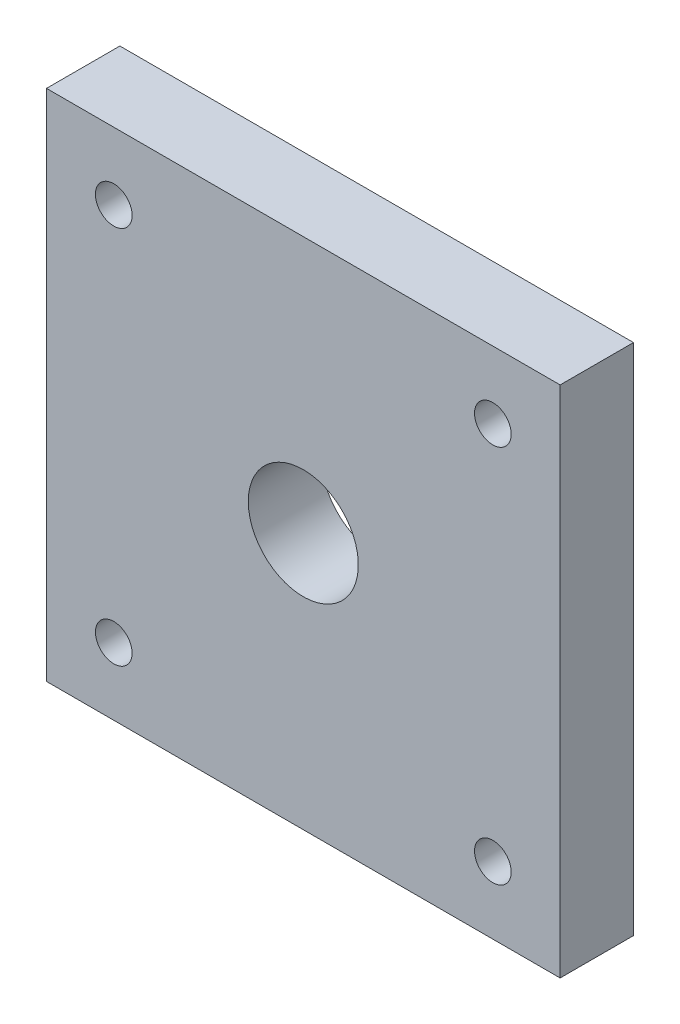
ISO-10303-21;
HEADER;
FILE_DESCRIPTION(('STEP AP214'),'2;1');
FILE_NAME('part.step','',(''),(''),'','','');
FILE_SCHEMA(('AUTOMOTIVE_DESIGN { 1 0 10303 214 1 1 1 1 }'));
ENDSEC;
DATA;
#1=APPLICATION_CONTEXT('core data for automotive mechanical design processes');
#2=APPLICATION_PROTOCOL_DEFINITION('international standard','automotive_design',2000,#1);
#3=PRODUCT_CONTEXT('',#1,'mechanical');
#4=PRODUCT('Part','Part','',(#3));
#5=PRODUCT_RELATED_PRODUCT_CATEGORY('part','',(#4));
#6=PRODUCT_DEFINITION_FORMATION('','',#4);
#7=PRODUCT_DEFINITION_CONTEXT('part definition',#1,'design');
#8=PRODUCT_DEFINITION('design','',#6,#7);
#9=PRODUCT_DEFINITION_SHAPE('','',#8);
#10=(LENGTH_UNIT() NAMED_UNIT(*) SI_UNIT(.MILLI.,.METRE.));
#11=(NAMED_UNIT(*) PLANE_ANGLE_UNIT() SI_UNIT($,.RADIAN.));
#12=(NAMED_UNIT(*) SI_UNIT($,.STERADIAN.) SOLID_ANGLE_UNIT());
#13=UNCERTAINTY_MEASURE_WITH_UNIT(LENGTH_MEASURE(1.E-05),#10,'distance_accuracy_value','');
#14=(GEOMETRIC_REPRESENTATION_CONTEXT(3) GLOBAL_UNCERTAINTY_ASSIGNED_CONTEXT((#13)) GLOBAL_UNIT_ASSIGNED_CONTEXT((#10,
#11,#12)) REPRESENTATION_CONTEXT('',''));
#15=CARTESIAN_POINT('',(0.,0.,0.));
#16=DIRECTION('',(0.,0.,1.));
#17=DIRECTION('',(1.,0.,0.));
#18=AXIS2_PLACEMENT_3D('',#15,#16,#17);
#19=CARTESIAN_POINT('',(21.,21.,6.));
#20=DIRECTION('',(-1.,0.,0.));
#21=DIRECTION('',(0.,-1.,0.));
#22=AXIS2_PLACEMENT_3D('',#19,#20,#21);
#23=PLANE('',#22);
#24=DIRECTION('',(0.,1.,0.));
#25=VECTOR('',#24,1.);
#26=CARTESIAN_POINT('',(21.,21.,0.));
#27=LINE('',#26,#25);
#28=CARTESIAN_POINT('',(21.,-21.,0.));
#29=VERTEX_POINT('',#28);
#30=CARTESIAN_POINT('',(21.,21.,0.));
#31=VERTEX_POINT('',#30);
#32=EDGE_CURVE('E107',#29,#31,#27,.T.);
#33=ORIENTED_EDGE('',*,*,#32,.T.);
#34=DIRECTION('',(0.,0.,-1.));
#35=VECTOR('',#34,1.);
#36=CARTESIAN_POINT('',(21.,21.,6.));
#37=LINE('',#36,#35);
#38=CARTESIAN_POINT('',(21.,21.,6.));
#39=VERTEX_POINT('',#38);
#40=EDGE_CURVE('E11',#39,#31,#37,.T.);
#41=ORIENTED_EDGE('',*,*,#40,.F.);
#42=DIRECTION('',(0.,1.,0.));
#43=VECTOR('',#42,1.);
#44=CARTESIAN_POINT('',(21.,21.,6.));
#45=LINE('',#44,#43);
#46=CARTESIAN_POINT('',(21.,-21.,6.));
#47=VERTEX_POINT('',#46);
#48=EDGE_CURVE('E91',#47,#39,#45,.T.);
#49=ORIENTED_EDGE('',*,*,#48,.F.);
#50=DIRECTION('',(0.,0.,-1.));
#51=VECTOR('',#50,1.);
#52=CARTESIAN_POINT('',(21.,-21.,6.));
#53=LINE('',#52,#51);
#54=EDGE_CURVE('E103',#47,#29,#53,.T.);
#55=ORIENTED_EDGE('',*,*,#54,.T.);
#56=EDGE_LOOP('',(#33,#41,#49,#55));
#57=FACE_BOUND('',#56,.T.);
#58=ADVANCED_FACE('F39',(#57),#23,.F.);
#59=CARTESIAN_POINT('',(-21.,21.,6.));
#60=DIRECTION('',(0.,-1.,0.));
#61=DIRECTION('',(0.,0.,-1.));
#62=AXIS2_PLACEMENT_3D('',#59,#60,#61);
#63=PLANE('',#62);
#64=DIRECTION('',(-1.,0.,0.));
#65=VECTOR('',#64,1.);
#66=CARTESIAN_POINT('',(-21.,21.,0.));
#67=LINE('',#66,#65);
#68=CARTESIAN_POINT('',(-21.,21.,0.));
#69=VERTEX_POINT('',#68);
#70=EDGE_CURVE('E96',#31,#69,#67,.T.);
#71=ORIENTED_EDGE('',*,*,#70,.T.);
#72=DIRECTION('',(0.,0.,-1.));
#73=VECTOR('',#72,1.);
#74=CARTESIAN_POINT('',(-21.,21.,6.));
#75=LINE('',#74,#73);
#76=CARTESIAN_POINT('',(-21.,21.,6.));
#77=VERTEX_POINT('',#76);
#78=EDGE_CURVE('E48',#77,#69,#75,.T.);
#79=ORIENTED_EDGE('',*,*,#78,.F.);
#80=DIRECTION('',(-1.,0.,0.));
#81=VECTOR('',#80,1.);
#82=CARTESIAN_POINT('',(-21.,21.,6.));
#83=LINE('',#82,#81);
#84=EDGE_CURVE('E86',#39,#77,#83,.T.);
#85=ORIENTED_EDGE('',*,*,#84,.F.);
#86=ORIENTED_EDGE('',*,*,#40,.T.);
#87=EDGE_LOOP('',(#71,#79,#85,#86));
#88=FACE_BOUND('',#87,.T.);
#89=ADVANCED_FACE('F95',(#88),#63,.F.);
#90=CARTESIAN_POINT('',(-21.,21.,6.));
#91=DIRECTION('',(1.,0.,0.));
#92=DIRECTION('',(0.,1.,0.));
#93=AXIS2_PLACEMENT_3D('',#90,#91,#92);
#94=PLANE('',#93);
#95=DIRECTION('',(0.,-1.,0.));
#96=VECTOR('',#95,1.);
#97=CARTESIAN_POINT('',(-21.,21.,0.));
#98=LINE('',#97,#96);
#99=CARTESIAN_POINT('',(-21.,-21.,0.));
#100=VERTEX_POINT('',#99);
#101=EDGE_CURVE('E73',#69,#100,#98,.T.);
#102=ORIENTED_EDGE('',*,*,#101,.T.);
#103=DIRECTION('',(0.,0.,-1.));
#104=VECTOR('',#103,1.);
#105=CARTESIAN_POINT('',(-21.,-21.,6.));
#106=LINE('',#105,#104);
#107=CARTESIAN_POINT('',(-21.,-21.,6.));
#108=VERTEX_POINT('',#107);
#109=EDGE_CURVE('E98',#108,#100,#106,.T.);
#110=ORIENTED_EDGE('',*,*,#109,.F.);
#111=DIRECTION('',(0.,-1.,0.));
#112=VECTOR('',#111,1.);
#113=CARTESIAN_POINT('',(-21.,21.,6.));
#114=LINE('',#113,#112);
#115=EDGE_CURVE('E89',#77,#108,#114,.T.);
#116=ORIENTED_EDGE('',*,*,#115,.F.);
#117=ORIENTED_EDGE('',*,*,#78,.T.);
#118=EDGE_LOOP('',(#102,#110,#116,#117));
#119=FACE_BOUND('',#118,.T.);
#120=ADVANCED_FACE('F99',(#119),#94,.F.);
#121=CARTESIAN_POINT('',(-21.,-21.,6.));
#122=DIRECTION('',(0.,1.,0.));
#123=DIRECTION('',(0.,0.,1.));
#124=AXIS2_PLACEMENT_3D('',#121,#122,#123);
#125=PLANE('',#124);
#126=DIRECTION('',(1.,0.,0.));
#127=VECTOR('',#126,1.);
#128=CARTESIAN_POINT('',(-21.,-21.,0.));
#129=LINE('',#128,#127);
#130=EDGE_CURVE('E79',#100,#29,#129,.T.);
#131=ORIENTED_EDGE('',*,*,#130,.T.);
#132=ORIENTED_EDGE('',*,*,#54,.F.);
#133=DIRECTION('',(1.,0.,0.));
#134=VECTOR('',#133,1.);
#135=CARTESIAN_POINT('',(-21.,-21.,6.));
#136=LINE('',#135,#134);
#137=EDGE_CURVE('E56',#108,#47,#136,.T.);
#138=ORIENTED_EDGE('',*,*,#137,.F.);
#139=ORIENTED_EDGE('',*,*,#109,.T.);
#140=EDGE_LOOP('',(#131,#132,#138,#139));
#141=FACE_BOUND('',#140,.T.);
#142=ADVANCED_FACE('F121',(#141),#125,.F.);
#143=CARTESIAN_POINT('',(0.,0.,6.));
#144=DIRECTION('',(0.,0.,1.));
#145=DIRECTION('',(1.,0.,0.));
#146=AXIS2_PLACEMENT_3D('',#143,#144,#145);
#147=PLANE('',#146);
#148=CARTESIAN_POINT('',(0.,0.,6.));
#149=DIRECTION('',(0.,0.,-1.));
#150=DIRECTION('',(-1.,0.,0.));
#151=AXIS2_PLACEMENT_3D('',#148,#149,#150);
#152=CIRCLE('',#151,4.5);
#153=CARTESIAN_POINT('',(-4.5,0.,6.));
#154=VERTEX_POINT('',#153);
#155=EDGE_CURVE('E141',#154,#154,#152,.T.);
#156=ORIENTED_EDGE('',*,*,#155,.T.);
#157=EDGE_LOOP('',(#156));
#158=FACE_BOUND('',#157,.T.);
#159=CARTESIAN_POINT('',(15.5,-15.5,6.));
#160=DIRECTION('',(0.,0.,-1.));
#161=DIRECTION('',(-1.,0.,0.));
#162=AXIS2_PLACEMENT_3D('',#159,#160,#161);
#163=CIRCLE('',#162,1.5);
#164=CARTESIAN_POINT('',(14.,-15.5,6.));
#165=VERTEX_POINT('',#164);
#166=EDGE_CURVE('E136',#165,#165,#163,.T.);
#167=ORIENTED_EDGE('',*,*,#166,.T.);
#168=EDGE_LOOP('',(#167));
#169=FACE_BOUND('',#168,.T.);
#170=CARTESIAN_POINT('',(-15.5,-15.5,6.));
#171=DIRECTION('',(0.,0.,-1.));
#172=DIRECTION('',(-1.,0.,0.));
#173=AXIS2_PLACEMENT_3D('',#170,#171,#172);
#174=CIRCLE('',#173,1.5);
#175=CARTESIAN_POINT('',(-17.,-15.5,6.));
#176=VERTEX_POINT('',#175);
#177=EDGE_CURVE('E145',#176,#176,#174,.T.);
#178=ORIENTED_EDGE('',*,*,#177,.T.);
#179=EDGE_LOOP('',(#178));
#180=FACE_BOUND('',#179,.T.);
#181=CARTESIAN_POINT('',(-15.5,15.5,6.));
#182=DIRECTION('',(0.,0.,-1.));
#183=DIRECTION('',(-1.,0.,0.));
#184=AXIS2_PLACEMENT_3D('',#181,#182,#183);
#185=CIRCLE('',#184,1.5);
#186=CARTESIAN_POINT('',(-17.,15.5,6.));
#187=VERTEX_POINT('',#186);
#188=EDGE_CURVE('E153',#187,#187,#185,.T.);
#189=ORIENTED_EDGE('',*,*,#188,.T.);
#190=EDGE_LOOP('',(#189));
#191=FACE_BOUND('',#190,.T.);
#192=CARTESIAN_POINT('',(15.5,15.5,6.));
#193=DIRECTION('',(0.,0.,-1.));
#194=DIRECTION('',(-1.,0.,0.));
#195=AXIS2_PLACEMENT_3D('',#192,#193,#194);
#196=CIRCLE('',#195,1.5);
#197=CARTESIAN_POINT('',(14.,15.5,6.));
#198=VERTEX_POINT('',#197);
#199=EDGE_CURVE('E111',#198,#198,#196,.T.);
#200=ORIENTED_EDGE('',*,*,#199,.T.);
#201=EDGE_LOOP('',(#200));
#202=FACE_BOUND('',#201,.T.);
#203=ORIENTED_EDGE('',*,*,#48,.T.);
#204=ORIENTED_EDGE('',*,*,#84,.T.);
#205=ORIENTED_EDGE('',*,*,#115,.T.);
#206=ORIENTED_EDGE('',*,*,#137,.T.);
#207=EDGE_LOOP('',(#203,#204,#205,#206));
#208=FACE_BOUND('',#207,.T.);
#209=ADVANCED_FACE('F87',(#158,#169,#180,#191,#202,#208),#147,.T.);
#210=CARTESIAN_POINT('',(0.,0.,0.));
#211=DIRECTION('',(0.,0.,1.));
#212=DIRECTION('',(1.,0.,0.));
#213=AXIS2_PLACEMENT_3D('',#210,#211,#212);
#214=PLANE('',#213);
#215=CARTESIAN_POINT('',(0.,0.,0.));
#216=DIRECTION('',(0.,0.,-1.));
#217=DIRECTION('',(-1.,0.,0.));
#218=AXIS2_PLACEMENT_3D('',#215,#216,#217);
#219=CIRCLE('',#218,4.5);
#220=CARTESIAN_POINT('',(-4.5,0.,0.));
#221=VERTEX_POINT('',#220);
#222=EDGE_CURVE('E160',#221,#221,#219,.T.);
#223=ORIENTED_EDGE('',*,*,#222,.F.);
#224=EDGE_LOOP('',(#223));
#225=FACE_BOUND('',#224,.T.);
#226=CARTESIAN_POINT('',(15.5,-15.5,0.));
#227=DIRECTION('',(0.,0.,-1.));
#228=DIRECTION('',(-1.,0.,0.));
#229=AXIS2_PLACEMENT_3D('',#226,#227,#228);
#230=CIRCLE('',#229,1.5);
#231=CARTESIAN_POINT('',(14.,-15.5,0.));
#232=VERTEX_POINT('',#231);
#233=EDGE_CURVE('E140',#232,#232,#230,.T.);
#234=ORIENTED_EDGE('',*,*,#233,.F.);
#235=EDGE_LOOP('',(#234));
#236=FACE_BOUND('',#235,.T.);
#237=CARTESIAN_POINT('',(-15.5,-15.5,0.));
#238=DIRECTION('',(0.,0.,-1.));
#239=DIRECTION('',(-1.,0.,0.));
#240=AXIS2_PLACEMENT_3D('',#237,#238,#239);
#241=CIRCLE('',#240,1.5);
#242=CARTESIAN_POINT('',(-17.,-15.5,0.));
#243=VERTEX_POINT('',#242);
#244=EDGE_CURVE('E149',#243,#243,#241,.T.);
#245=ORIENTED_EDGE('',*,*,#244,.F.);
#246=EDGE_LOOP('',(#245));
#247=FACE_BOUND('',#246,.T.);
#248=CARTESIAN_POINT('',(-15.5,15.5,0.));
#249=DIRECTION('',(0.,0.,-1.));
#250=DIRECTION('',(-1.,0.,0.));
#251=AXIS2_PLACEMENT_3D('',#248,#249,#250);
#252=CIRCLE('',#251,1.5);
#253=CARTESIAN_POINT('',(-17.,15.5,0.));
#254=VERTEX_POINT('',#253);
#255=EDGE_CURVE('E132',#254,#254,#252,.T.);
#256=ORIENTED_EDGE('',*,*,#255,.F.);
#257=EDGE_LOOP('',(#256));
#258=FACE_BOUND('',#257,.T.);
#259=CARTESIAN_POINT('',(15.5,15.5,0.));
#260=DIRECTION('',(0.,0.,-1.));
#261=DIRECTION('',(-1.,0.,0.));
#262=AXIS2_PLACEMENT_3D('',#259,#260,#261);
#263=CIRCLE('',#262,1.5);
#264=CARTESIAN_POINT('',(14.,15.5,0.));
#265=VERTEX_POINT('',#264);
#266=EDGE_CURVE('E128',#265,#265,#263,.T.);
#267=ORIENTED_EDGE('',*,*,#266,.F.);
#268=EDGE_LOOP('',(#267));
#269=FACE_BOUND('',#268,.T.);
#270=ORIENTED_EDGE('',*,*,#32,.F.);
#271=ORIENTED_EDGE('',*,*,#130,.F.);
#272=ORIENTED_EDGE('',*,*,#101,.F.);
#273=ORIENTED_EDGE('',*,*,#70,.F.);
#274=EDGE_LOOP('',(#270,#271,#272,#273));
#275=FACE_BOUND('',#274,.T.);
#276=ADVANCED_FACE('F124',(#225,#236,#247,#258,#269,#275),#214,.F.);
#277=CARTESIAN_POINT('',(15.5,15.5,6.));
#278=DIRECTION('',(0.,0.,-1.));
#279=DIRECTION('',(-1.,0.,0.));
#280=AXIS2_PLACEMENT_3D('',#277,#278,#279);
#281=CYLINDRICAL_SURFACE('',#280,1.5);
#282=ORIENTED_EDGE('',*,*,#199,.F.);
#283=EDGE_LOOP('',(#282));
#284=FACE_BOUND('',#283,.T.);
#285=ORIENTED_EDGE('',*,*,#266,.T.);
#286=EDGE_LOOP('',(#285));
#287=FACE_BOUND('',#286,.T.);
#288=ADVANCED_FACE('F179',(#284,#287),#281,.F.);
#289=CARTESIAN_POINT('',(-15.5,15.5,6.));
#290=DIRECTION('',(0.,0.,-1.));
#291=DIRECTION('',(-1.,0.,0.));
#292=AXIS2_PLACEMENT_3D('',#289,#290,#291);
#293=CYLINDRICAL_SURFACE('',#292,1.5);
#294=ORIENTED_EDGE('',*,*,#188,.F.);
#295=EDGE_LOOP('',(#294));
#296=FACE_BOUND('',#295,.T.);
#297=ORIENTED_EDGE('',*,*,#255,.T.);
#298=EDGE_LOOP('',(#297));
#299=FACE_BOUND('',#298,.T.);
#300=ADVANCED_FACE('F190',(#296,#299),#293,.F.);
#301=CARTESIAN_POINT('',(-15.5,-15.5,6.));
#302=DIRECTION('',(0.,0.,-1.));
#303=DIRECTION('',(-1.,0.,0.));
#304=AXIS2_PLACEMENT_3D('',#301,#302,#303);
#305=CYLINDRICAL_SURFACE('',#304,1.5);
#306=ORIENTED_EDGE('',*,*,#177,.F.);
#307=EDGE_LOOP('',(#306));
#308=FACE_BOUND('',#307,.T.);
#309=ORIENTED_EDGE('',*,*,#244,.T.);
#310=EDGE_LOOP('',(#309));
#311=FACE_BOUND('',#310,.T.);
#312=ADVANCED_FACE('F196',(#308,#311),#305,.F.);
#313=CARTESIAN_POINT('',(15.5,-15.5,6.));
#314=DIRECTION('',(0.,0.,-1.));
#315=DIRECTION('',(-1.,0.,0.));
#316=AXIS2_PLACEMENT_3D('',#313,#314,#315);
#317=CYLINDRICAL_SURFACE('',#316,1.5);
#318=ORIENTED_EDGE('',*,*,#166,.F.);
#319=EDGE_LOOP('',(#318));
#320=FACE_BOUND('',#319,.T.);
#321=ORIENTED_EDGE('',*,*,#233,.T.);
#322=EDGE_LOOP('',(#321));
#323=FACE_BOUND('',#322,.T.);
#324=ADVANCED_FACE('F173',(#320,#323),#317,.F.);
#325=CARTESIAN_POINT('',(0.,0.,6.));
#326=DIRECTION('',(0.,0.,-1.));
#327=DIRECTION('',(-1.,0.,0.));
#328=AXIS2_PLACEMENT_3D('',#325,#326,#327);
#329=CYLINDRICAL_SURFACE('',#328,4.5);
#330=ORIENTED_EDGE('',*,*,#155,.F.);
#331=EDGE_LOOP('',(#330));
#332=FACE_BOUND('',#331,.T.);
#333=ORIENTED_EDGE('',*,*,#222,.T.);
#334=EDGE_LOOP('',(#333));
#335=FACE_BOUND('',#334,.T.);
#336=ADVANCED_FACE('F170',(#332,#335),#329,.F.);
#337=CLOSED_SHELL('',(#58,#89,#120,#142,#209,#276,#288,#300,#312,#324,#336));
#338=MANIFOLD_SOLID_BREP('B2',#337);
#339=ADVANCED_BREP_SHAPE_REPRESENTATION('',(#18,#338),#14);
#340=SHAPE_DEFINITION_REPRESENTATION(#9,#339);
ENDSEC;
END-ISO-10303-21;
